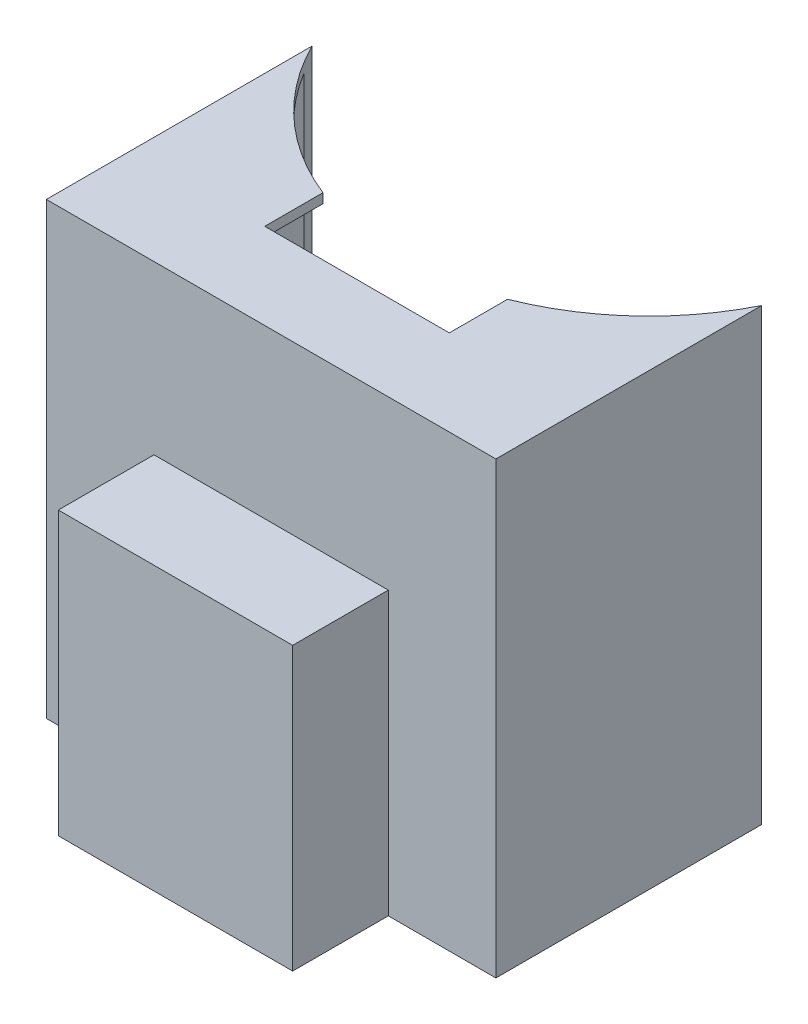
ISO-10303-21;
HEADER;
FILE_DESCRIPTION(('STEP AP214'),'2;1');
FILE_NAME('part.step','',(''),(''),'','','');
FILE_SCHEMA(('AUTOMOTIVE_DESIGN { 1 0 10303 214 1 1 1 1 }'));
ENDSEC;
DATA;
#1=APPLICATION_CONTEXT('core data for automotive mechanical design processes');
#2=APPLICATION_PROTOCOL_DEFINITION('international standard','automotive_design',2000,#1);
#3=PRODUCT_CONTEXT('',#1,'mechanical');
#4=PRODUCT('Part','Part','',(#3));
#5=PRODUCT_RELATED_PRODUCT_CATEGORY('part','',(#4));
#6=PRODUCT_DEFINITION_FORMATION('','',#4);
#7=PRODUCT_DEFINITION_CONTEXT('part definition',#1,'design');
#8=PRODUCT_DEFINITION('design','',#6,#7);
#9=PRODUCT_DEFINITION_SHAPE('','',#8);
#10=(LENGTH_UNIT() NAMED_UNIT(*) SI_UNIT(.MILLI.,.METRE.));
#11=(NAMED_UNIT(*) PLANE_ANGLE_UNIT() SI_UNIT($,.RADIAN.));
#12=(NAMED_UNIT(*) SI_UNIT($,.STERADIAN.) SOLID_ANGLE_UNIT());
#13=UNCERTAINTY_MEASURE_WITH_UNIT(LENGTH_MEASURE(1.E-05),#10,'distance_accuracy_value','');
#14=(GEOMETRIC_REPRESENTATION_CONTEXT(3) GLOBAL_UNCERTAINTY_ASSIGNED_CONTEXT((#13)) GLOBAL_UNIT_ASSIGNED_CONTEXT((#10,
#11,#12)) REPRESENTATION_CONTEXT('',''));
#15=CARTESIAN_POINT('',(0.,0.,0.));
#16=DIRECTION('',(0.,0.,1.));
#17=DIRECTION('',(1.,0.,0.));
#18=AXIS2_PLACEMENT_3D('',#15,#16,#17);
#19=CARTESIAN_POINT('',(0.,0.,76.9615242270663));
#20=DIRECTION('',(0.,0.,-1.));
#21=DIRECTION('',(-1.,0.,0.));
#22=AXIS2_PLACEMENT_3D('',#19,#20,#21);
#23=PLANE('',#22);
#24=DIRECTION('',(-1.,0.,0.));
#25=VECTOR('',#24,1.);
#26=CARTESIAN_POINT('',(0.,90.,76.9615242270663));
#27=LINE('',#26,#25);
#28=CARTESIAN_POINT('',(45.,90.,76.9615242270663));
#29=VERTEX_POINT('',#28);
#30=CARTESIAN_POINT('',(-45.,89.9999999999999,76.9615242270663));
#31=VERTEX_POINT('',#30);
#32=EDGE_CURVE('E235',#29,#31,#27,.T.);
#33=ORIENTED_EDGE('',*,*,#32,.F.);
#34=DIRECTION('',(0.,1.,0.));
#35=VECTOR('',#34,1.);
#36=CARTESIAN_POINT('',(45.,-55.6054717134685,76.9615242270663));
#37=LINE('',#36,#35);
#38=CARTESIAN_POINT('',(45.,-2.00000000000003,76.9615242270663));
#39=VERTEX_POINT('',#38);
#40=EDGE_CURVE('E57',#39,#29,#37,.T.);
#41=ORIENTED_EDGE('',*,*,#40,.F.);
#42=DIRECTION('',(-1.,0.,0.));
#43=VECTOR('',#42,1.);
#44=CARTESIAN_POINT('',(0.,-2.00000000000003,76.9615242270663));
#45=LINE('',#44,#43);
#46=CARTESIAN_POINT('',(22.5,-2.00000000000003,76.9615242270663));
#47=VERTEX_POINT('',#46);
#48=EDGE_CURVE('E186',#39,#47,#45,.T.);
#49=ORIENTED_EDGE('',*,*,#48,.T.);
#50=DIRECTION('',(0.,-1.,0.));
#51=VECTOR('',#50,1.);
#52=CARTESIAN_POINT('',(22.5,0.,76.9615242270663));
#53=LINE('',#52,#51);
#54=CARTESIAN_POINT('',(22.5,55.,76.9615242270663));
#55=VERTEX_POINT('',#54);
#56=EDGE_CURVE('E317',#55,#47,#53,.T.);
#57=ORIENTED_EDGE('',*,*,#56,.F.);
#58=DIRECTION('',(1.,0.,0.));
#59=VECTOR('',#58,1.);
#60=CARTESIAN_POINT('',(0.,55.,76.9615242270663));
#61=LINE('',#60,#59);
#62=CARTESIAN_POINT('',(-22.5,55.,76.9615242270663));
#63=VERTEX_POINT('',#62);
#64=EDGE_CURVE('E302',#63,#55,#61,.T.);
#65=ORIENTED_EDGE('',*,*,#64,.F.);
#66=DIRECTION('',(0.,1.,0.));
#67=VECTOR('',#66,1.);
#68=CARTESIAN_POINT('',(-22.5,0.,76.9615242270663));
#69=LINE('',#68,#67);
#70=CARTESIAN_POINT('',(-22.5,-2.00000000000003,76.9615242270663));
#71=VERTEX_POINT('',#70);
#72=EDGE_CURVE('E290',#71,#63,#69,.T.);
#73=ORIENTED_EDGE('',*,*,#72,.F.);
#74=CARTESIAN_POINT('',(-45.,-2.00000000000004,76.9615242270663));
#75=VERTEX_POINT('',#74);
#76=EDGE_CURVE('E314',#71,#75,#45,.T.);
#77=ORIENTED_EDGE('',*,*,#76,.T.);
#78=DIRECTION('',(0.,1.,0.));
#79=VECTOR('',#78,1.);
#80=CARTESIAN_POINT('',(-45.,-55.6054717134685,76.9615242270663));
#81=LINE('',#80,#79);
#82=EDGE_CURVE('E209',#75,#31,#81,.T.);
#83=ORIENTED_EDGE('',*,*,#82,.T.);
#84=EDGE_LOOP('',(#33,#41,#49,#57,#65,#73,#77,#83));
#85=FACE_BOUND('',#84,.T.);
#86=ADVANCED_FACE('F40',(#85),#23,.T.);
#87=CARTESIAN_POINT('',(-22.5,0.,78.9615242270663));
#88=DIRECTION('',(-1.,0.,0.));
#89=DIRECTION('',(0.,-1.,0.));
#90=AXIS2_PLACEMENT_3D('',#87,#88,#89);
#91=PLANE('',#90);
#92=DIRECTION('',(0.,-1.,0.));
#93=VECTOR('',#92,1.);
#94=CARTESIAN_POINT('',(-22.5,0.,96.9615242270663));
#95=LINE('',#94,#93);
#96=CARTESIAN_POINT('',(-22.5,55.,96.9615242270663));
#97=VERTEX_POINT('',#96);
#98=CARTESIAN_POINT('',(-22.5,-2.00000000000003,96.9615242270663));
#99=VERTEX_POINT('',#98);
#100=EDGE_CURVE('E265',#97,#99,#95,.T.);
#101=ORIENTED_EDGE('',*,*,#100,.T.);
#102=DIRECTION('',(0.,0.,-1.));
#103=VECTOR('',#102,1.);
#104=CARTESIAN_POINT('',(-22.5,-2.00000000000003,78.9615242270663));
#105=LINE('',#104,#103);
#106=EDGE_CURVE('E44',#99,#71,#105,.T.);
#107=ORIENTED_EDGE('',*,*,#106,.T.);
#108=ORIENTED_EDGE('',*,*,#72,.T.);
#109=DIRECTION('',(0.,0.,-1.));
#110=VECTOR('',#109,1.);
#111=CARTESIAN_POINT('',(-22.5,55.,78.9615242270663));
#112=LINE('',#111,#110);
#113=EDGE_CURVE('E11',#97,#63,#112,.T.);
#114=ORIENTED_EDGE('',*,*,#113,.F.);
#115=EDGE_LOOP('',(#101,#107,#108,#114));
#116=FACE_BOUND('',#115,.T.);
#117=ADVANCED_FACE('F42',(#116),#91,.F.);
#118=CARTESIAN_POINT('',(0.,55.,78.9615242270663));
#119=DIRECTION('',(0.,1.,0.));
#120=DIRECTION('',(0.,0.,1.));
#121=AXIS2_PLACEMENT_3D('',#118,#119,#120);
#122=PLANE('',#121);
#123=DIRECTION('',(-1.,0.,0.));
#124=VECTOR('',#123,1.);
#125=CARTESIAN_POINT('',(0.,55.,96.9615242270663));
#126=LINE('',#125,#124);
#127=CARTESIAN_POINT('',(22.5,55.,96.9615242270663));
#128=VERTEX_POINT('',#127);
#129=EDGE_CURVE('E262',#128,#97,#126,.T.);
#130=ORIENTED_EDGE('',*,*,#129,.T.);
#131=ORIENTED_EDGE('',*,*,#113,.T.);
#132=ORIENTED_EDGE('',*,*,#64,.T.);
#133=DIRECTION('',(0.,0.,-1.));
#134=VECTOR('',#133,1.);
#135=CARTESIAN_POINT('',(22.5,55.,78.9615242270663));
#136=LINE('',#135,#134);
#137=EDGE_CURVE('E49',#128,#55,#136,.T.);
#138=ORIENTED_EDGE('',*,*,#137,.F.);
#139=EDGE_LOOP('',(#130,#131,#132,#138));
#140=FACE_BOUND('',#139,.T.);
#141=ADVANCED_FACE('F365',(#140),#122,.F.);
#142=CARTESIAN_POINT('',(22.5,0.,78.9615242270663));
#143=DIRECTION('',(1.,0.,0.));
#144=DIRECTION('',(0.,1.,0.));
#145=AXIS2_PLACEMENT_3D('',#142,#143,#144);
#146=PLANE('',#145);
#147=DIRECTION('',(0.,1.,0.));
#148=VECTOR('',#147,1.);
#149=CARTESIAN_POINT('',(22.5,0.,96.9615242270663));
#150=LINE('',#149,#148);
#151=CARTESIAN_POINT('',(22.5,-2.00000000000003,96.9615242270663));
#152=VERTEX_POINT('',#151);
#153=EDGE_CURVE('E252',#152,#128,#150,.T.);
#154=ORIENTED_EDGE('',*,*,#153,.T.);
#155=ORIENTED_EDGE('',*,*,#137,.T.);
#156=ORIENTED_EDGE('',*,*,#56,.T.);
#157=DIRECTION('',(0.,0.,-1.));
#158=VECTOR('',#157,1.);
#159=CARTESIAN_POINT('',(22.5,-2.00000000000003,78.9615242270663));
#160=LINE('',#159,#158);
#161=EDGE_CURVE('E323',#152,#47,#160,.T.);
#162=ORIENTED_EDGE('',*,*,#161,.F.);
#163=EDGE_LOOP('',(#154,#155,#156,#162));
#164=FACE_BOUND('',#163,.T.);
#165=ADVANCED_FACE('F356',(#164),#146,.F.);
#166=CARTESIAN_POINT('',(0.,0.,78.9615242270663));
#167=DIRECTION('',(0.,0.,-1.));
#168=DIRECTION('',(-1.,0.,0.));
#169=AXIS2_PLACEMENT_3D('',#166,#167,#168);
#170=PLANE('',#169);
#171=DIRECTION('',(0.,-1.,0.));
#172=VECTOR('',#171,1.);
#173=CARTESIAN_POINT('',(-24.5,0.,78.9615242270663));
#174=LINE('',#173,#172);
#175=CARTESIAN_POINT('',(-24.5,57.,78.9615242270663));
#176=VERTEX_POINT('',#175);
#177=CARTESIAN_POINT('',(-24.5,-2.00000000000003,78.9615242270663));
#178=VERTEX_POINT('',#177);
#179=EDGE_CURVE('E65',#176,#178,#174,.T.);
#180=ORIENTED_EDGE('',*,*,#179,.F.);
#181=DIRECTION('',(-1.,0.,0.));
#182=VECTOR('',#181,1.);
#183=CARTESIAN_POINT('',(0.,57.,78.9615242270663));
#184=LINE('',#183,#182);
#185=CARTESIAN_POINT('',(24.5,57.,78.9615242270663));
#186=VERTEX_POINT('',#185);
#187=EDGE_CURVE('E283',#186,#176,#184,.T.);
#188=ORIENTED_EDGE('',*,*,#187,.F.);
#189=DIRECTION('',(0.,1.,0.));
#190=VECTOR('',#189,1.);
#191=CARTESIAN_POINT('',(24.5,0.,78.9615242270663));
#192=LINE('',#191,#190);
#193=CARTESIAN_POINT('',(24.5,-2.00000000000003,78.9615242270663));
#194=VERTEX_POINT('',#193);
#195=EDGE_CURVE('E275',#194,#186,#192,.T.);
#196=ORIENTED_EDGE('',*,*,#195,.F.);
#197=DIRECTION('',(-1.,0.,0.));
#198=VECTOR('',#197,1.);
#199=CARTESIAN_POINT('',(0.,-2.00000000000003,78.9615242270663));
#200=LINE('',#199,#198);
#201=CARTESIAN_POINT('',(47.,-2.00000000000003,78.9615242270663));
#202=VERTEX_POINT('',#201);
#203=EDGE_CURVE('E303',#202,#194,#200,.T.);
#204=ORIENTED_EDGE('',*,*,#203,.F.);
#205=DIRECTION('',(0.,-1.,0.));
#206=VECTOR('',#205,1.);
#207=CARTESIAN_POINT('',(47.,0.,78.9615242270663));
#208=LINE('',#207,#206);
#209=CARTESIAN_POINT('',(47.,92.,78.9615242270663));
#210=VERTEX_POINT('',#209);
#211=EDGE_CURVE('E309',#210,#202,#208,.T.);
#212=ORIENTED_EDGE('',*,*,#211,.F.);
#213=DIRECTION('',(1.,0.,0.));
#214=VECTOR('',#213,1.);
#215=CARTESIAN_POINT('',(0.,92.,78.9615242270663));
#216=LINE('',#215,#214);
#217=CARTESIAN_POINT('',(-47.,92.,78.9615242270663));
#218=VERTEX_POINT('',#217);
#219=EDGE_CURVE('E306',#218,#210,#216,.T.);
#220=ORIENTED_EDGE('',*,*,#219,.F.);
#221=DIRECTION('',(0.,-1.,0.));
#222=VECTOR('',#221,1.);
#223=CARTESIAN_POINT('',(-47.,0.,78.9615242270663));
#224=LINE('',#223,#222);
#225=CARTESIAN_POINT('',(-47.,-2.00000000000003,78.9615242270663));
#226=VERTEX_POINT('',#225);
#227=EDGE_CURVE('E301',#218,#226,#224,.T.);
#228=ORIENTED_EDGE('',*,*,#227,.T.);
#229=EDGE_CURVE('E299',#178,#226,#200,.T.);
#230=ORIENTED_EDGE('',*,*,#229,.F.);
#231=EDGE_LOOP('',(#180,#188,#196,#204,#212,#220,#228,#230));
#232=FACE_BOUND('',#231,.T.);
#233=ADVANCED_FACE('F354',(#232),#170,.F.);
#234=CARTESIAN_POINT('',(0.,-2.00000000000003,78.9615242270663));
#235=DIRECTION('',(0.,-1.,0.));
#236=DIRECTION('',(0.,0.,-1.));
#237=AXIS2_PLACEMENT_3D('',#234,#235,#236);
#238=PLANE('',#237);
#239=ORIENTED_EDGE('',*,*,#48,.F.);
#240=DIRECTION('',(0.,0.,-1.));
#241=VECTOR('',#240,1.);
#242=CARTESIAN_POINT('',(45.,-2.00000000000003,0.));
#243=LINE('',#242,#241);
#244=CARTESIAN_POINT('',(45.,-2.00000000000004,27.0416345659799));
#245=VERTEX_POINT('',#244);
#246=EDGE_CURVE('E179',#39,#245,#243,.T.);
#247=ORIENTED_EDGE('',*,*,#246,.T.);
#248=CARTESIAN_POINT('',(0.,-2.00000000000003,0.));
#249=DIRECTION('',(0.,-1.,0.));
#250=DIRECTION('',(0.,0.,-1.));
#251=AXIS2_PLACEMENT_3D('',#248,#249,#250);
#252=CIRCLE('',#251,52.5);
#253=CARTESIAN_POINT('',(47.,-2.00000000000003,23.3933751305792));
#254=VERTEX_POINT('',#253);
#255=EDGE_CURVE('E183',#254,#245,#252,.T.);
#256=ORIENTED_EDGE('',*,*,#255,.F.);
#257=DIRECTION('',(0.,0.,-1.));
#258=VECTOR('',#257,1.);
#259=CARTESIAN_POINT('',(47.,-2.00000000000003,78.9615242270663));
#260=LINE('',#259,#258);
#261=EDGE_CURVE('E325',#202,#254,#260,.T.);
#262=ORIENTED_EDGE('',*,*,#261,.F.);
#263=ORIENTED_EDGE('',*,*,#203,.T.);
#264=DIRECTION('',(0.,0.,-1.));
#265=VECTOR('',#264,1.);
#266=CARTESIAN_POINT('',(24.5,-2.00000000000003,98.9615242270663));
#267=LINE('',#266,#265);
#268=CARTESIAN_POINT('',(24.5,-2.00000000000003,98.9615242270663));
#269=VERTEX_POINT('',#268);
#270=EDGE_CURVE('E287',#269,#194,#267,.T.);
#271=ORIENTED_EDGE('',*,*,#270,.F.);
#272=DIRECTION('',(-1.,0.,0.));
#273=VECTOR('',#272,1.);
#274=CARTESIAN_POINT('',(0.,-2.00000000000003,98.9615242270663));
#275=LINE('',#274,#273);
#276=CARTESIAN_POINT('',(-24.5,-2.00000000000003,98.9615242270663));
#277=VERTEX_POINT('',#276);
#278=EDGE_CURVE('E271',#269,#277,#275,.T.);
#279=ORIENTED_EDGE('',*,*,#278,.T.);
#280=DIRECTION('',(0.,0.,-1.));
#281=VECTOR('',#280,1.);
#282=CARTESIAN_POINT('',(-24.5,-2.00000000000003,98.9615242270663));
#283=LINE('',#282,#281);
#284=EDGE_CURVE('E281',#277,#178,#283,.T.);
#285=ORIENTED_EDGE('',*,*,#284,.T.);
#286=ORIENTED_EDGE('',*,*,#229,.T.);
#287=DIRECTION('',(0.,0.,-1.));
#288=VECTOR('',#287,1.);
#289=CARTESIAN_POINT('',(-47.,-2.00000000000003,78.9615242270663));
#290=LINE('',#289,#288);
#291=CARTESIAN_POINT('',(-47.,-2.00000000000004,23.3933751305792));
#292=VERTEX_POINT('',#291);
#293=EDGE_CURVE('E330',#226,#292,#290,.T.);
#294=ORIENTED_EDGE('',*,*,#293,.T.);
#295=CARTESIAN_POINT('',(0.,-2.00000000000003,0.));
#296=DIRECTION('',(0.,-1.,0.));
#297=DIRECTION('',(0.,0.,-1.));
#298=AXIS2_PLACEMENT_3D('',#295,#296,#297);
#299=CIRCLE('',#298,52.5);
#300=CARTESIAN_POINT('',(-45.,-2.00000000000003,27.0416345659799));
#301=VERTEX_POINT('',#300);
#302=EDGE_CURVE('E213',#292,#301,#299,.F.);
#303=ORIENTED_EDGE('',*,*,#302,.T.);
#304=DIRECTION('',(0.,0.,-1.));
#305=VECTOR('',#304,1.);
#306=CARTESIAN_POINT('',(-45.,-2.00000000000003,76.9615242270663));
#307=LINE('',#306,#305);
#308=EDGE_CURVE('E188',#75,#301,#307,.T.);
#309=ORIENTED_EDGE('',*,*,#308,.F.);
#310=ORIENTED_EDGE('',*,*,#76,.F.);
#311=ORIENTED_EDGE('',*,*,#106,.F.);
#312=DIRECTION('',(1.,0.,0.));
#313=VECTOR('',#312,1.);
#314=CARTESIAN_POINT('',(0.,-2.00000000000003,96.9615242270663));
#315=LINE('',#314,#313);
#316=EDGE_CURVE('E268',#99,#152,#315,.T.);
#317=ORIENTED_EDGE('',*,*,#316,.T.);
#318=ORIENTED_EDGE('',*,*,#161,.T.);
#319=EDGE_LOOP('',(#239,#247,#256,#262,#263,#271,#279,#285,#286,#294,#303,#309,#310,#311,#317,#318));
#320=FACE_BOUND('',#319,.T.);
#321=ADVANCED_FACE('F181',(#320),#238,.T.);
#322=CARTESIAN_POINT('',(47.,0.,78.9615242270663));
#323=DIRECTION('',(1.,0.,0.));
#324=DIRECTION('',(0.,1.,0.));
#325=AXIS2_PLACEMENT_3D('',#322,#323,#324);
#326=PLANE('',#325);
#327=ORIENTED_EDGE('',*,*,#261,.T.);
#328=DIRECTION('',(0.,1.,0.));
#329=VECTOR('',#328,1.);
#330=CARTESIAN_POINT('',(47.,-55.6054717134685,23.3933751305792));
#331=LINE('',#330,#329);
#332=CARTESIAN_POINT('',(47.,92.,23.3933751305792));
#333=VERTEX_POINT('',#332);
#334=EDGE_CURVE('E201',#254,#333,#331,.T.);
#335=ORIENTED_EDGE('',*,*,#334,.T.);
#336=DIRECTION('',(0.,0.,-1.));
#337=VECTOR('',#336,1.);
#338=CARTESIAN_POINT('',(47.,92.,78.9615242270663));
#339=LINE('',#338,#337);
#340=EDGE_CURVE('E327',#210,#333,#339,.T.);
#341=ORIENTED_EDGE('',*,*,#340,.F.);
#342=ORIENTED_EDGE('',*,*,#211,.T.);
#343=EDGE_LOOP('',(#327,#335,#341,#342));
#344=FACE_BOUND('',#343,.T.);
#345=ADVANCED_FACE('F362',(#344),#326,.T.);
#346=CARTESIAN_POINT('',(0.,92.,78.9615242270663));
#347=DIRECTION('',(0.,1.,0.));
#348=DIRECTION('',(0.,0.,1.));
#349=AXIS2_PLACEMENT_3D('',#346,#347,#348);
#350=PLANE('',#349);
#351=ORIENTED_EDGE('',*,*,#340,.T.);
#352=CARTESIAN_POINT('',(0.,92.,0.));
#353=DIRECTION('',(0.,1.,0.));
#354=DIRECTION('',(0.,0.,1.));
#355=AXIS2_PLACEMENT_3D('',#352,#353,#354);
#356=CIRCLE('',#355,52.5);
#357=CARTESIAN_POINT('',(19.3,92.,48.8237647053154));
#358=VERTEX_POINT('',#357);
#359=EDGE_CURVE('E206',#358,#333,#356,.T.);
#360=ORIENTED_EDGE('',*,*,#359,.F.);
#361=DIRECTION('',(0.,0.,-1.));
#362=VECTOR('',#361,1.);
#363=CARTESIAN_POINT('',(19.3,92.,0.));
#364=LINE('',#363,#362);
#365=CARTESIAN_POINT('',(19.3,92.,61.0015242270663));
#366=VERTEX_POINT('',#365);
#367=EDGE_CURVE('E241',#366,#358,#364,.T.);
#368=ORIENTED_EDGE('',*,*,#367,.F.);
#369=DIRECTION('',(1.,0.,0.));
#370=VECTOR('',#369,1.);
#371=CARTESIAN_POINT('',(0.,92.,61.0015242270663));
#372=LINE('',#371,#370);
#373=CARTESIAN_POINT('',(-19.3,92.,61.0015242270663));
#374=VERTEX_POINT('',#373);
#375=EDGE_CURVE('E243',#374,#366,#372,.T.);
#376=ORIENTED_EDGE('',*,*,#375,.F.);
#377=DIRECTION('',(0.,0.,-1.));
#378=VECTOR('',#377,1.);
#379=CARTESIAN_POINT('',(-19.3,92.,0.));
#380=LINE('',#379,#378);
#381=CARTESIAN_POINT('',(-19.3,92.,48.8237647053154));
#382=VERTEX_POINT('',#381);
#383=EDGE_CURVE('E245',#374,#382,#380,.T.);
#384=ORIENTED_EDGE('',*,*,#383,.T.);
#385=CARTESIAN_POINT('',(0.,92.,0.));
#386=DIRECTION('',(0.,1.,0.));
#387=DIRECTION('',(0.,0.,1.));
#388=AXIS2_PLACEMENT_3D('',#385,#386,#387);
#389=CIRCLE('',#388,52.5);
#390=CARTESIAN_POINT('',(-47.,92.,23.3933751305792));
#391=VERTEX_POINT('',#390);
#392=EDGE_CURVE('E223',#391,#382,#389,.T.);
#393=ORIENTED_EDGE('',*,*,#392,.F.);
#394=DIRECTION('',(0.,0.,-1.));
#395=VECTOR('',#394,1.);
#396=CARTESIAN_POINT('',(-47.,92.,78.9615242270663));
#397=LINE('',#396,#395);
#398=EDGE_CURVE('E329',#218,#391,#397,.T.);
#399=ORIENTED_EDGE('',*,*,#398,.F.);
#400=ORIENTED_EDGE('',*,*,#219,.T.);
#401=EDGE_LOOP('',(#351,#360,#368,#376,#384,#393,#399,#400));
#402=FACE_BOUND('',#401,.T.);
#403=ADVANCED_FACE('F381',(#402),#350,.T.);
#404=CARTESIAN_POINT('',(-47.,0.,78.9615242270663));
#405=DIRECTION('',(1.,0.,0.));
#406=DIRECTION('',(0.,1.,0.));
#407=AXIS2_PLACEMENT_3D('',#404,#405,#406);
#408=PLANE('',#407);
#409=ORIENTED_EDGE('',*,*,#398,.T.);
#410=DIRECTION('',(0.,1.,0.));
#411=VECTOR('',#410,1.);
#412=CARTESIAN_POINT('',(-47.,-55.6054717134685,23.3933751305792));
#413=LINE('',#412,#411);
#414=EDGE_CURVE('E210',#292,#391,#413,.T.);
#415=ORIENTED_EDGE('',*,*,#414,.F.);
#416=ORIENTED_EDGE('',*,*,#293,.F.);
#417=ORIENTED_EDGE('',*,*,#227,.F.);
#418=EDGE_LOOP('',(#409,#415,#416,#417));
#419=FACE_BOUND('',#418,.T.);
#420=ADVANCED_FACE('F384',(#419),#408,.F.);
#421=CARTESIAN_POINT('',(24.5,0.,98.9615242270663));
#422=DIRECTION('',(-1.,0.,0.));
#423=DIRECTION('',(0.,0.,1.));
#424=AXIS2_PLACEMENT_3D('',#421,#422,#423);
#425=PLANE('',#424);
#426=ORIENTED_EDGE('',*,*,#195,.T.);
#427=DIRECTION('',(0.,0.,-1.));
#428=VECTOR('',#427,1.);
#429=CARTESIAN_POINT('',(24.5,57.,98.9615242270663));
#430=LINE('',#429,#428);
#431=CARTESIAN_POINT('',(24.5,57.,98.9615242270663));
#432=VERTEX_POINT('',#431);
#433=EDGE_CURVE('E291',#432,#186,#430,.T.);
#434=ORIENTED_EDGE('',*,*,#433,.F.);
#435=DIRECTION('',(0.,1.,0.));
#436=VECTOR('',#435,1.);
#437=CARTESIAN_POINT('',(24.5,0.,98.9615242270663));
#438=LINE('',#437,#436);
#439=EDGE_CURVE('E279',#269,#432,#438,.T.);
#440=ORIENTED_EDGE('',*,*,#439,.F.);
#441=ORIENTED_EDGE('',*,*,#270,.T.);
#442=EDGE_LOOP('',(#426,#434,#440,#441));
#443=FACE_BOUND('',#442,.T.);
#444=ADVANCED_FACE('F342',(#443),#425,.F.);
#445=CARTESIAN_POINT('',(0.,57.,98.9615242270663));
#446=DIRECTION('',(0.,-1.,0.));
#447=DIRECTION('',(0.,0.,-1.));
#448=AXIS2_PLACEMENT_3D('',#445,#446,#447);
#449=PLANE('',#448);
#450=ORIENTED_EDGE('',*,*,#187,.T.);
#451=DIRECTION('',(0.,0.,-1.));
#452=VECTOR('',#451,1.);
#453=CARTESIAN_POINT('',(-24.5,57.,98.9615242270663));
#454=LINE('',#453,#452);
#455=CARTESIAN_POINT('',(-24.5,57.,98.9615242270663));
#456=VERTEX_POINT('',#455);
#457=EDGE_CURVE('E294',#456,#176,#454,.T.);
#458=ORIENTED_EDGE('',*,*,#457,.F.);
#459=DIRECTION('',(-1.,0.,0.));
#460=VECTOR('',#459,1.);
#461=CARTESIAN_POINT('',(0.,57.,98.9615242270663));
#462=LINE('',#461,#460);
#463=EDGE_CURVE('E277',#432,#456,#462,.T.);
#464=ORIENTED_EDGE('',*,*,#463,.F.);
#465=ORIENTED_EDGE('',*,*,#433,.T.);
#466=EDGE_LOOP('',(#450,#458,#464,#465));
#467=FACE_BOUND('',#466,.T.);
#468=ADVANCED_FACE('F353',(#467),#449,.F.);
#469=CARTESIAN_POINT('',(-24.5,0.,98.9615242270663));
#470=DIRECTION('',(1.,0.,0.));
#471=DIRECTION('',(0.,0.,-1.));
#472=AXIS2_PLACEMENT_3D('',#469,#470,#471);
#473=PLANE('',#472);
#474=ORIENTED_EDGE('',*,*,#179,.T.);
#475=ORIENTED_EDGE('',*,*,#284,.F.);
#476=DIRECTION('',(0.,-1.,0.));
#477=VECTOR('',#476,1.);
#478=CARTESIAN_POINT('',(-24.5,0.,98.9615242270663));
#479=LINE('',#478,#477);
#480=EDGE_CURVE('E274',#456,#277,#479,.T.);
#481=ORIENTED_EDGE('',*,*,#480,.F.);
#482=ORIENTED_EDGE('',*,*,#457,.T.);
#483=EDGE_LOOP('',(#474,#475,#481,#482));
#484=FACE_BOUND('',#483,.T.);
#485=ADVANCED_FACE('F351',(#484),#473,.F.);
#486=CARTESIAN_POINT('',(0.,0.,98.9615242270663));
#487=DIRECTION('',(0.,0.,1.));
#488=DIRECTION('',(1.,0.,0.));
#489=AXIS2_PLACEMENT_3D('',#486,#487,#488);
#490=PLANE('',#489);
#491=ORIENTED_EDGE('',*,*,#278,.F.);
#492=ORIENTED_EDGE('',*,*,#439,.T.);
#493=ORIENTED_EDGE('',*,*,#463,.T.);
#494=ORIENTED_EDGE('',*,*,#480,.T.);
#495=EDGE_LOOP('',(#491,#492,#493,#494));
#496=FACE_BOUND('',#495,.T.);
#497=ADVANCED_FACE('F346',(#496),#490,.T.);
#498=CARTESIAN_POINT('',(0.,0.,96.9615242270663));
#499=DIRECTION('',(0.,0.,1.));
#500=DIRECTION('',(1.,0.,0.));
#501=AXIS2_PLACEMENT_3D('',#498,#499,#500);
#502=PLANE('',#501);
#503=ORIENTED_EDGE('',*,*,#153,.F.);
#504=ORIENTED_EDGE('',*,*,#316,.F.);
#505=ORIENTED_EDGE('',*,*,#100,.F.);
#506=ORIENTED_EDGE('',*,*,#129,.F.);
#507=EDGE_LOOP('',(#503,#504,#505,#506));
#508=FACE_BOUND('',#507,.T.);
#509=ADVANCED_FACE('F410',(#508),#502,.F.);
#510=CARTESIAN_POINT('',(0.,90.,0.));
#511=DIRECTION('',(0.,1.,0.));
#512=DIRECTION('',(0.,0.,1.));
#513=AXIS2_PLACEMENT_3D('',#510,#511,#512);
#514=CYLINDRICAL_SURFACE('',#513,52.5);
#515=ORIENTED_EDGE('',*,*,#359,.T.);
#516=ORIENTED_EDGE('',*,*,#334,.F.);
#517=ORIENTED_EDGE('',*,*,#255,.T.);
#518=DIRECTION('',(0.,1.,0.));
#519=VECTOR('',#518,1.);
#520=CARTESIAN_POINT('',(45.,-55.6054717134685,27.0416345659799));
#521=LINE('',#520,#519);
#522=CARTESIAN_POINT('',(45.,89.9999999999999,27.0416345659799));
#523=VERTEX_POINT('',#522);
#524=EDGE_CURVE('E192',#245,#523,#521,.T.);
#525=ORIENTED_EDGE('',*,*,#524,.T.);
#526=CARTESIAN_POINT('',(0.,90.,0.));
#527=DIRECTION('',(0.,1.,0.));
#528=DIRECTION('',(0.,0.,1.));
#529=AXIS2_PLACEMENT_3D('',#526,#527,#528);
#530=CIRCLE('',#529,52.5);
#531=CARTESIAN_POINT('',(19.3,90.,48.8237647053154));
#532=VERTEX_POINT('',#531);
#533=EDGE_CURVE('E220',#532,#523,#530,.T.);
#534=ORIENTED_EDGE('',*,*,#533,.F.);
#535=DIRECTION('',(0.,1.,0.));
#536=VECTOR('',#535,1.);
#537=CARTESIAN_POINT('',(19.3,90.,48.8237647053154));
#538=LINE('',#537,#536);
#539=EDGE_CURVE('E239',#532,#358,#538,.T.);
#540=ORIENTED_EDGE('',*,*,#539,.T.);
#541=EDGE_LOOP('',(#515,#516,#517,#525,#534,#540));
#542=FACE_BOUND('',#541,.T.);
#543=ADVANCED_FACE('F199',(#542),#514,.F.);
#544=CARTESIAN_POINT('',(0.,90.,0.));
#545=DIRECTION('',(0.,1.,0.));
#546=DIRECTION('',(0.,0.,1.));
#547=AXIS2_PLACEMENT_3D('',#544,#545,#546);
#548=CYLINDRICAL_SURFACE('',#547,52.5);
#549=ORIENTED_EDGE('',*,*,#392,.T.);
#550=DIRECTION('',(0.,1.,0.));
#551=VECTOR('',#550,1.);
#552=CARTESIAN_POINT('',(-19.3,90.,48.8237647053154));
#553=LINE('',#552,#551);
#554=CARTESIAN_POINT('',(-19.3,90.,48.8237647053154));
#555=VERTEX_POINT('',#554);
#556=EDGE_CURVE('E250',#555,#382,#553,.T.);
#557=ORIENTED_EDGE('',*,*,#556,.F.);
#558=CARTESIAN_POINT('',(0.,90.,0.));
#559=DIRECTION('',(0.,1.,0.));
#560=DIRECTION('',(0.,0.,1.));
#561=AXIS2_PLACEMENT_3D('',#558,#559,#560);
#562=CIRCLE('',#561,52.5);
#563=CARTESIAN_POINT('',(-45.,90.,27.0416345659799));
#564=VERTEX_POINT('',#563);
#565=EDGE_CURVE('E230',#564,#555,#562,.T.);
#566=ORIENTED_EDGE('',*,*,#565,.F.);
#567=DIRECTION('',(0.,1.,0.));
#568=VECTOR('',#567,1.);
#569=CARTESIAN_POINT('',(-45.,-55.6054717134685,27.0416345659799));
#570=LINE('',#569,#568);
#571=EDGE_CURVE('E207',#301,#564,#570,.T.);
#572=ORIENTED_EDGE('',*,*,#571,.F.);
#573=ORIENTED_EDGE('',*,*,#302,.F.);
#574=ORIENTED_EDGE('',*,*,#414,.T.);
#575=EDGE_LOOP('',(#549,#557,#566,#572,#573,#574));
#576=FACE_BOUND('',#575,.T.);
#577=ADVANCED_FACE('F400',(#576),#548,.F.);
#578=CARTESIAN_POINT('',(-19.3,90.,0.));
#579=DIRECTION('',(1.,0.,0.));
#580=DIRECTION('',(0.,0.,-1.));
#581=AXIS2_PLACEMENT_3D('',#578,#579,#580);
#582=PLANE('',#581);
#583=ORIENTED_EDGE('',*,*,#383,.F.);
#584=DIRECTION('',(0.,1.,0.));
#585=VECTOR('',#584,1.);
#586=CARTESIAN_POINT('',(-19.3,90.,61.0015242270663));
#587=LINE('',#586,#585);
#588=CARTESIAN_POINT('',(-19.3,90.,61.0015242270663));
#589=VERTEX_POINT('',#588);
#590=EDGE_CURVE('E253',#589,#374,#587,.T.);
#591=ORIENTED_EDGE('',*,*,#590,.F.);
#592=DIRECTION('',(0.,0.,-1.));
#593=VECTOR('',#592,1.);
#594=CARTESIAN_POINT('',(-19.3,90.,0.));
#595=LINE('',#594,#593);
#596=EDGE_CURVE('E227',#589,#555,#595,.T.);
#597=ORIENTED_EDGE('',*,*,#596,.T.);
#598=ORIENTED_EDGE('',*,*,#556,.T.);
#599=EDGE_LOOP('',(#583,#591,#597,#598));
#600=FACE_BOUND('',#599,.T.);
#601=ADVANCED_FACE('F490',(#600),#582,.T.);
#602=CARTESIAN_POINT('',(0.,90.,61.0015242270663));
#603=DIRECTION('',(0.,0.,1.));
#604=DIRECTION('',(1.,0.,0.));
#605=AXIS2_PLACEMENT_3D('',#602,#603,#604);
#606=PLANE('',#605);
#607=ORIENTED_EDGE('',*,*,#375,.T.);
#608=DIRECTION('',(0.,1.,0.));
#609=VECTOR('',#608,1.);
#610=CARTESIAN_POINT('',(19.3,90.,61.0015242270663));
#611=LINE('',#610,#609);
#612=CARTESIAN_POINT('',(19.3,90.,61.0015242270663));
#613=VERTEX_POINT('',#612);
#614=EDGE_CURVE('E255',#613,#366,#611,.T.);
#615=ORIENTED_EDGE('',*,*,#614,.F.);
#616=DIRECTION('',(1.,0.,0.));
#617=VECTOR('',#616,1.);
#618=CARTESIAN_POINT('',(0.,90.,61.0015242270663));
#619=LINE('',#618,#617);
#620=EDGE_CURVE('E225',#589,#613,#619,.T.);
#621=ORIENTED_EDGE('',*,*,#620,.F.);
#622=ORIENTED_EDGE('',*,*,#590,.T.);
#623=EDGE_LOOP('',(#607,#615,#621,#622));
#624=FACE_BOUND('',#623,.T.);
#625=ADVANCED_FACE('F500',(#624),#606,.F.);
#626=CARTESIAN_POINT('',(19.3,90.,0.));
#627=DIRECTION('',(1.,0.,0.));
#628=DIRECTION('',(0.,0.,-1.));
#629=AXIS2_PLACEMENT_3D('',#626,#627,#628);
#630=PLANE('',#629);
#631=ORIENTED_EDGE('',*,*,#367,.T.);
#632=ORIENTED_EDGE('',*,*,#539,.F.);
#633=DIRECTION('',(0.,0.,-1.));
#634=VECTOR('',#633,1.);
#635=CARTESIAN_POINT('',(19.3,90.,0.));
#636=LINE('',#635,#634);
#637=EDGE_CURVE('E222',#613,#532,#636,.T.);
#638=ORIENTED_EDGE('',*,*,#637,.F.);
#639=ORIENTED_EDGE('',*,*,#614,.T.);
#640=EDGE_LOOP('',(#631,#632,#638,#639));
#641=FACE_BOUND('',#640,.T.);
#642=ADVANCED_FACE('F510',(#641),#630,.F.);
#643=CARTESIAN_POINT('',(0.,90.,0.));
#644=DIRECTION('',(0.,1.,0.));
#645=DIRECTION('',(0.,0.,1.));
#646=AXIS2_PLACEMENT_3D('',#643,#644,#645);
#647=PLANE('',#646);
#648=ORIENTED_EDGE('',*,*,#533,.T.);
#649=DIRECTION('',(0.,0.,-1.));
#650=VECTOR('',#649,1.);
#651=CARTESIAN_POINT('',(45.,90.,0.));
#652=LINE('',#651,#650);
#653=EDGE_CURVE('E194',#29,#523,#652,.T.);
#654=ORIENTED_EDGE('',*,*,#653,.F.);
#655=ORIENTED_EDGE('',*,*,#32,.T.);
#656=DIRECTION('',(0.,0.,-1.));
#657=VECTOR('',#656,1.);
#658=CARTESIAN_POINT('',(-45.,90.,0.));
#659=LINE('',#658,#657);
#660=EDGE_CURVE('E232',#31,#564,#659,.T.);
#661=ORIENTED_EDGE('',*,*,#660,.T.);
#662=ORIENTED_EDGE('',*,*,#565,.T.);
#663=ORIENTED_EDGE('',*,*,#596,.F.);
#664=ORIENTED_EDGE('',*,*,#620,.T.);
#665=ORIENTED_EDGE('',*,*,#637,.T.);
#666=EDGE_LOOP('',(#648,#654,#655,#661,#662,#663,#664,#665));
#667=FACE_BOUND('',#666,.T.);
#668=ADVANCED_FACE('F519',(#667),#647,.F.);
#669=CARTESIAN_POINT('',(-45.,-55.6054717134685,76.9615242270663));
#670=DIRECTION('',(1.,0.,0.));
#671=DIRECTION('',(0.,0.,-1.));
#672=AXIS2_PLACEMENT_3D('',#669,#670,#671);
#673=PLANE('',#672);
#674=ORIENTED_EDGE('',*,*,#660,.F.);
#675=ORIENTED_EDGE('',*,*,#82,.F.);
#676=ORIENTED_EDGE('',*,*,#308,.T.);
#677=ORIENTED_EDGE('',*,*,#571,.T.);
#678=EDGE_LOOP('',(#674,#675,#676,#677));
#679=FACE_BOUND('',#678,.T.);
#680=ADVANCED_FACE('F528',(#679),#673,.T.);
#681=CARTESIAN_POINT('',(45.,-55.6054717134685,0.));
#682=DIRECTION('',(1.,0.,0.));
#683=DIRECTION('',(0.,0.,-1.));
#684=AXIS2_PLACEMENT_3D('',#681,#682,#683);
#685=PLANE('',#684);
#686=ORIENTED_EDGE('',*,*,#40,.T.);
#687=ORIENTED_EDGE('',*,*,#653,.T.);
#688=ORIENTED_EDGE('',*,*,#524,.F.);
#689=ORIENTED_EDGE('',*,*,#246,.F.);
#690=EDGE_LOOP('',(#686,#687,#688,#689));
#691=FACE_BOUND('',#690,.T.);
#692=ADVANCED_FACE('F193',(#691),#685,.F.);
#693=CLOSED_SHELL('',(#86,#117,#141,#165,#233,#321,#345,#403,#420,#444,#468,#485,#497,#509,#543,
#577,#601,#625,#642,#668,#680,#692));
#694=MANIFOLD_SOLID_BREP('B2',#693);
#695=ADVANCED_BREP_SHAPE_REPRESENTATION('',(#18,#694),#14);
#696=SHAPE_DEFINITION_REPRESENTATION(#9,#695);
ENDSEC;
END-ISO-10303-21;
